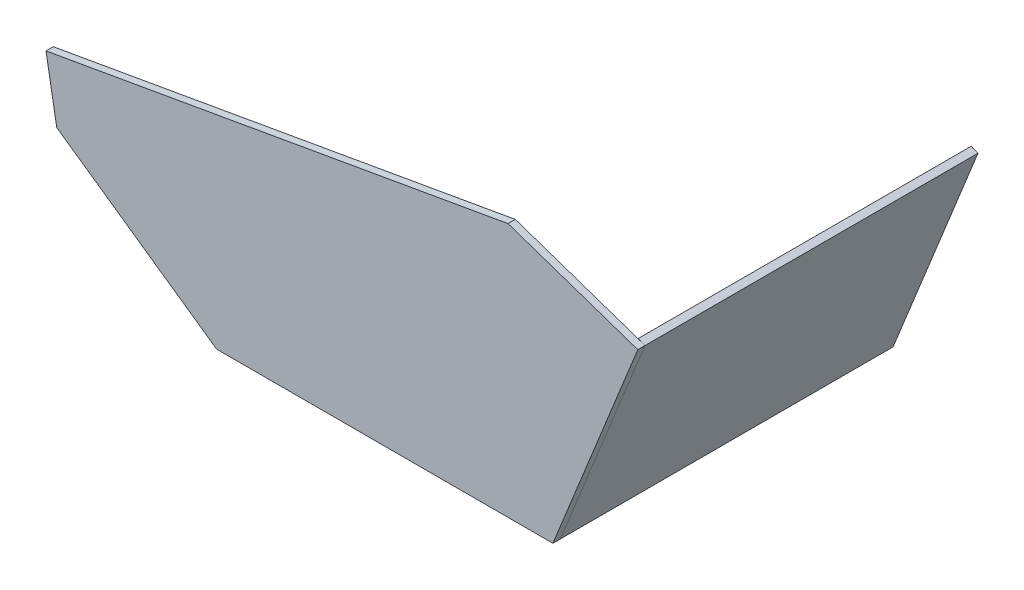
ISO-10303-21;
HEADER;
FILE_DESCRIPTION(('STEP AP214'),'2;1');
FILE_NAME('part.step','',(''),(''),'','','');
FILE_SCHEMA(('AUTOMOTIVE_DESIGN { 1 0 10303 214 1 1 1 1 }'));
ENDSEC;
DATA;
#1=APPLICATION_CONTEXT('core data for automotive mechanical design processes');
#2=APPLICATION_PROTOCOL_DEFINITION('international standard','automotive_design',2000,#1);
#3=PRODUCT_CONTEXT('',#1,'mechanical');
#4=PRODUCT('Part','Part','',(#3));
#5=PRODUCT_RELATED_PRODUCT_CATEGORY('part','',(#4));
#6=PRODUCT_DEFINITION_FORMATION('','',#4);
#7=PRODUCT_DEFINITION_CONTEXT('part definition',#1,'design');
#8=PRODUCT_DEFINITION('design','',#6,#7);
#9=PRODUCT_DEFINITION_SHAPE('','',#8);
#10=(LENGTH_UNIT() NAMED_UNIT(*) SI_UNIT(.MILLI.,.METRE.));
#11=(NAMED_UNIT(*) PLANE_ANGLE_UNIT() SI_UNIT($,.RADIAN.));
#12=(NAMED_UNIT(*) SI_UNIT($,.STERADIAN.) SOLID_ANGLE_UNIT());
#13=UNCERTAINTY_MEASURE_WITH_UNIT(LENGTH_MEASURE(1.E-05),#10,'distance_accuracy_value','');
#14=(GEOMETRIC_REPRESENTATION_CONTEXT(3) GLOBAL_UNCERTAINTY_ASSIGNED_CONTEXT((#13)) GLOBAL_UNIT_ASSIGNED_CONTEXT((#10,
#11,#12)) REPRESENTATION_CONTEXT('',''));
#15=CARTESIAN_POINT('',(0.,0.,0.));
#16=DIRECTION('',(0.,0.,1.));
#17=DIRECTION('',(1.,0.,0.));
#18=AXIS2_PLACEMENT_3D('',#15,#16,#17);
#19=CARTESIAN_POINT('',(218.308936159681,183.058019045167,296.35));
#20=DIRECTION('',(-0.323059329466778,-0.946378713647172,0.));
#21=DIRECTION('',(0.946378713647172,-0.323059329466778,0.));
#22=AXIS2_PLACEMENT_3D('',#19,#20,#21);
#23=PLANE('',#22);
#24=DIRECTION('',(-0.946378713647172,0.323059329466778,0.));
#25=VECTOR('',#24,1.);
#26=CARTESIAN_POINT('',(218.308936159681,183.058019045167,290.));
#27=LINE('',#26,#25);
#28=CARTESIAN_POINT('',(218.308936159681,183.058019045167,290.));
#29=VERTEX_POINT('',#28);
#30=CARTESIAN_POINT('',(105.266414319831,221.64663138417,290.));
#31=VERTEX_POINT('',#30);
#32=EDGE_CURVE('E137',#29,#31,#27,.T.);
#33=ORIENTED_EDGE('',*,*,#32,.T.);
#34=DIRECTION('',(0.,0.,-1.));
#35=VECTOR('',#34,1.);
#36=CARTESIAN_POINT('',(105.266414319831,221.64663138417,296.35));
#37=LINE('',#36,#35);
#38=CARTESIAN_POINT('',(105.266414319831,221.64663138417,296.35));
#39=VERTEX_POINT('',#38);
#40=EDGE_CURVE('E12',#39,#31,#37,.T.);
#41=ORIENTED_EDGE('',*,*,#40,.F.);
#42=DIRECTION('',(-0.946378713647172,0.323059329466778,0.));
#43=VECTOR('',#42,1.);
#44=CARTESIAN_POINT('',(218.308936159681,183.058019045167,296.35));
#45=LINE('',#44,#43);
#46=CARTESIAN_POINT('',(218.308936159681,183.058019045167,296.35));
#47=VERTEX_POINT('',#46);
#48=EDGE_CURVE('E147',#47,#39,#45,.T.);
#49=ORIENTED_EDGE('',*,*,#48,.F.);
#50=DIRECTION('',(0.,0.,-1.));
#51=VECTOR('',#50,1.);
#52=CARTESIAN_POINT('',(218.308936159681,183.058019045167,296.35));
#53=LINE('',#52,#51);
#54=EDGE_CURVE('E133',#47,#29,#53,.T.);
#55=ORIENTED_EDGE('',*,*,#54,.T.);
#56=EDGE_LOOP('',(#33,#41,#49,#55));
#57=FACE_BOUND('',#56,.T.);
#58=ADVANCED_FACE('F53',(#57),#23,.F.);
#59=CARTESIAN_POINT('',(-297.202483124154,150.68050586881,296.35));
#60=DIRECTION('',(0.173648177666924,-0.984807753012209,0.));
#61=DIRECTION('',(0.984807753012209,0.173648177666924,0.));
#62=AXIS2_PLACEMENT_3D('',#59,#60,#61);
#63=PLANE('',#62);
#64=DIRECTION('',(-0.984807753012209,-0.173648177666924,0.));
#65=VECTOR('',#64,1.);
#66=CARTESIAN_POINT('',(-297.202483124154,150.68050586881,290.));
#67=LINE('',#66,#65);
#68=CARTESIAN_POINT('',(-297.202483124154,150.68050586881,290.));
#69=VERTEX_POINT('',#68);
#70=EDGE_CURVE('E140',#31,#69,#67,.T.);
#71=ORIENTED_EDGE('',*,*,#70,.T.);
#72=DIRECTION('',(0.,0.,-1.));
#73=VECTOR('',#72,1.);
#74=CARTESIAN_POINT('',(-297.202483124154,150.68050586881,296.35));
#75=LINE('',#74,#73);
#76=CARTESIAN_POINT('',(-297.202483124154,150.68050586881,296.35));
#77=VERTEX_POINT('',#76);
#78=EDGE_CURVE('E61',#77,#69,#75,.T.);
#79=ORIENTED_EDGE('',*,*,#78,.F.);
#80=DIRECTION('',(-0.984807753012209,-0.173648177666924,0.));
#81=VECTOR('',#80,1.);
#82=CARTESIAN_POINT('',(-297.202483124154,150.68050586881,296.35));
#83=LINE('',#82,#81);
#84=EDGE_CURVE('E106',#39,#77,#83,.T.);
#85=ORIENTED_EDGE('',*,*,#84,.F.);
#86=ORIENTED_EDGE('',*,*,#40,.T.);
#87=EDGE_LOOP('',(#71,#79,#85,#86));
#88=FACE_BOUND('',#87,.T.);
#89=ADVANCED_FACE('F171',(#88),#63,.F.);
#90=CARTESIAN_POINT('',(-287.826734681323,97.5079941796767,296.35));
#91=DIRECTION('',(0.984807753012209,0.173648177666924,0.));
#92=DIRECTION('',(-0.173648177666924,0.984807753012209,0.));
#93=AXIS2_PLACEMENT_3D('',#90,#91,#92);
#94=PLANE('',#93);
#95=DIRECTION('',(0.173648177666924,-0.984807753012209,0.));
#96=VECTOR('',#95,1.);
#97=CARTESIAN_POINT('',(-287.826734681323,97.5079941796767,290.));
#98=LINE('',#97,#96);
#99=CARTESIAN_POINT('',(-287.826734681323,97.5079941796767,290.));
#100=VERTEX_POINT('',#99);
#101=EDGE_CURVE('E142',#69,#100,#98,.T.);
#102=ORIENTED_EDGE('',*,*,#101,.T.);
#103=DIRECTION('',(0.,0.,-1.));
#104=VECTOR('',#103,1.);
#105=CARTESIAN_POINT('',(-287.826734681323,97.5079941796767,296.35));
#106=LINE('',#105,#104);
#107=CARTESIAN_POINT('',(-287.826734681323,97.5079941796767,296.35));
#108=VERTEX_POINT('',#107);
#109=EDGE_CURVE('E128',#108,#100,#106,.T.);
#110=ORIENTED_EDGE('',*,*,#109,.F.);
#111=DIRECTION('',(0.173648177666924,-0.984807753012209,0.));
#112=VECTOR('',#111,1.);
#113=CARTESIAN_POINT('',(-287.826734681323,97.5079941796767,296.35));
#114=LINE('',#113,#112);
#115=EDGE_CURVE('E119',#77,#108,#114,.T.);
#116=ORIENTED_EDGE('',*,*,#115,.F.);
#117=ORIENTED_EDGE('',*,*,#78,.T.);
#118=EDGE_LOOP('',(#102,#110,#116,#117));
#119=FACE_BOUND('',#118,.T.);
#120=ADVANCED_FACE('F153',(#119),#94,.F.);
#121=CARTESIAN_POINT('',(-287.826734681323,97.5079941796767,296.35));
#122=DIRECTION('',(0.57357643635104,0.819152044288996,0.));
#123=DIRECTION('',(-0.819152044288996,0.57357643635104,0.));
#124=AXIS2_PLACEMENT_3D('',#121,#122,#123);
#125=PLANE('',#124);
#126=DIRECTION('',(0.819152044288996,-0.57357643635104,0.));
#127=VECTOR('',#126,1.);
#128=CARTESIAN_POINT('',(-287.826734681323,97.5079941796767,290.));
#129=LINE('',#128,#127);
#130=CARTESIAN_POINT('',(-148.570887152194,0.,290.));
#131=VERTEX_POINT('',#130);
#132=EDGE_CURVE('E127',#100,#131,#129,.T.);
#133=ORIENTED_EDGE('',*,*,#132,.T.);
#134=DIRECTION('',(0.,0.,-1.));
#135=VECTOR('',#134,1.);
#136=CARTESIAN_POINT('',(-148.570887152194,0.,296.35));
#137=LINE('',#136,#135);
#138=CARTESIAN_POINT('',(-148.570887152194,0.,296.35));
#139=VERTEX_POINT('',#138);
#140=EDGE_CURVE('E124',#139,#131,#137,.T.);
#141=ORIENTED_EDGE('',*,*,#140,.F.);
#142=DIRECTION('',(0.819152044288996,-0.57357643635104,0.));
#143=VECTOR('',#142,1.);
#144=CARTESIAN_POINT('',(-287.826734681323,97.5079941796767,296.35));
#145=LINE('',#144,#143);
#146=EDGE_CURVE('E113',#108,#139,#145,.T.);
#147=ORIENTED_EDGE('',*,*,#146,.F.);
#148=ORIENTED_EDGE('',*,*,#109,.T.);
#149=EDGE_LOOP('',(#133,#141,#147,#148));
#150=FACE_BOUND('',#149,.T.);
#151=ADVANCED_FACE('F125',(#150),#125,.F.);
#152=CARTESIAN_POINT('',(144.348695616003,0.,296.35));
#153=DIRECTION('',(0.,1.,0.));
#154=DIRECTION('',(-1.,0.,0.));
#155=AXIS2_PLACEMENT_3D('',#152,#153,#154);
#156=PLANE('',#155);
#157=DIRECTION('',(1.,0.,0.));
#158=VECTOR('',#157,1.);
#159=CARTESIAN_POINT('',(144.348695616003,0.,290.));
#160=LINE('',#159,#158);
#161=CARTESIAN_POINT('',(144.348695616003,0.,290.));
#162=VERTEX_POINT('',#161);
#163=EDGE_CURVE('E92',#131,#162,#160,.T.);
#164=ORIENTED_EDGE('',*,*,#163,.T.);
#165=DIRECTION('',(0.,0.,-1.));
#166=VECTOR('',#165,1.);
#167=CARTESIAN_POINT('',(144.348695616003,0.,296.35));
#168=LINE('',#167,#166);
#169=CARTESIAN_POINT('',(144.348695616003,0.,296.35));
#170=VERTEX_POINT('',#169);
#171=EDGE_CURVE('E129',#170,#162,#168,.T.);
#172=ORIENTED_EDGE('',*,*,#171,.F.);
#173=DIRECTION('',(1.,0.,0.));
#174=VECTOR('',#173,1.);
#175=CARTESIAN_POINT('',(144.348695616003,0.,296.35));
#176=LINE('',#175,#174);
#177=EDGE_CURVE('E117',#139,#170,#176,.T.);
#178=ORIENTED_EDGE('',*,*,#177,.F.);
#179=ORIENTED_EDGE('',*,*,#140,.T.);
#180=EDGE_LOOP('',(#164,#172,#178,#179));
#181=FACE_BOUND('',#180,.T.);
#182=ADVANCED_FACE('F131',(#181),#156,.F.);
#183=CARTESIAN_POINT('',(144.348695616003,0.,296.35));
#184=DIRECTION('',(-0.927183854566789,0.374606593415909,0.));
#185=DIRECTION('',(-0.374606593415909,-0.927183854566789,0.));
#186=AXIS2_PLACEMENT_3D('',#183,#184,#185);
#187=PLANE('',#186);
#188=DIRECTION('',(0.374606593415909,0.927183854566789,0.));
#189=VECTOR('',#188,1.);
#190=CARTESIAN_POINT('',(144.348695616003,0.,290.));
#191=LINE('',#190,#189);
#192=EDGE_CURVE('E98',#162,#29,#191,.T.);
#193=ORIENTED_EDGE('',*,*,#192,.T.);
#194=ORIENTED_EDGE('',*,*,#54,.F.);
#195=DIRECTION('',(0.374606593415909,0.927183854566789,0.));
#196=VECTOR('',#195,1.);
#197=CARTESIAN_POINT('',(144.348695616003,0.,296.35));
#198=LINE('',#197,#196);
#199=EDGE_CURVE('E69',#170,#47,#198,.T.);
#200=ORIENTED_EDGE('',*,*,#199,.F.);
#201=ORIENTED_EDGE('',*,*,#171,.T.);
#202=EDGE_LOOP('',(#193,#194,#200,#201));
#203=FACE_BOUND('',#202,.T.);
#204=ADVANCED_FACE('F160',(#203),#187,.F.);
#205=CARTESIAN_POINT('',(0.,0.,296.35));
#206=DIRECTION('',(0.,0.,-1.));
#207=DIRECTION('',(-1.,0.,0.));
#208=AXIS2_PLACEMENT_3D('',#205,#206,#207);
#209=PLANE('',#208);
#210=ORIENTED_EDGE('',*,*,#48,.T.);
#211=ORIENTED_EDGE('',*,*,#84,.T.);
#212=ORIENTED_EDGE('',*,*,#115,.T.);
#213=ORIENTED_EDGE('',*,*,#146,.T.);
#214=ORIENTED_EDGE('',*,*,#177,.T.);
#215=ORIENTED_EDGE('',*,*,#199,.T.);
#216=EDGE_LOOP('',(#210,#211,#212,#213,#214,#215));
#217=FACE_BOUND('',#216,.T.);
#218=ADVANCED_FACE('F115',(#217),#209,.F.);
#219=CARTESIAN_POINT('',(0.,0.,290.));
#220=DIRECTION('',(0.,0.,-1.));
#221=DIRECTION('',(-1.,0.,0.));
#222=AXIS2_PLACEMENT_3D('',#219,#220,#221);
#223=PLANE('',#222);
#224=ORIENTED_EDGE('',*,*,#32,.F.);
#225=ORIENTED_EDGE('',*,*,#192,.F.);
#226=ORIENTED_EDGE('',*,*,#163,.F.);
#227=ORIENTED_EDGE('',*,*,#132,.F.);
#228=ORIENTED_EDGE('',*,*,#101,.F.);
#229=ORIENTED_EDGE('',*,*,#70,.F.);
#230=EDGE_LOOP('',(#224,#225,#226,#227,#228,#229));
#231=FACE_BOUND('',#230,.T.);
#232=ADVANCED_FACE('F156',(#231),#223,.T.);
#233=CLOSED_SHELL('',(#58,#89,#120,#151,#182,#204,#218,#232));
#234=MANIFOLD_SOLID_BREP('B2',#233);
#235=CARTESIAN_POINT('',(212.421318683182,185.436770913358,290.));
#236=DIRECTION('',(0.927183854566788,-0.374606593415909,0.));
#237=DIRECTION('',(0.374606593415909,0.927183854566789,0.));
#238=AXIS2_PLACEMENT_3D('',#235,#236,#237);
#239=PLANE('',#238);
#240=DIRECTION('',(-0.374606593415909,-0.927183854566789,0.));
#241=VECTOR('',#240,1.);
#242=CARTESIAN_POINT('',(212.421318683182,185.436770913358,0.));
#243=LINE('',#242,#241);
#244=CARTESIAN_POINT('',(212.421318683182,185.436770913358,0.));
#245=VERTEX_POINT('',#244);
#246=CARTESIAN_POINT('',(137.5,0.,0.));
#247=VERTEX_POINT('',#246);
#248=EDGE_CURVE('E292',#245,#247,#243,.T.);
#249=ORIENTED_EDGE('',*,*,#248,.T.);
#250=DIRECTION('',(0.,0.,-1.));
#251=VECTOR('',#250,1.);
#252=CARTESIAN_POINT('',(137.5,0.,290.));
#253=LINE('',#252,#251);
#254=CARTESIAN_POINT('',(137.5,0.,290.));
#255=VERTEX_POINT('',#254);
#256=EDGE_CURVE('E51',#255,#247,#253,.T.);
#257=ORIENTED_EDGE('',*,*,#256,.F.);
#258=DIRECTION('',(-0.374606593415909,-0.927183854566789,0.));
#259=VECTOR('',#258,1.);
#260=CARTESIAN_POINT('',(212.421318683182,185.436770913358,290.));
#261=LINE('',#260,#259);
#262=CARTESIAN_POINT('',(212.421318683182,185.436770913358,290.));
#263=VERTEX_POINT('',#262);
#264=EDGE_CURVE('E280',#263,#255,#261,.T.);
#265=ORIENTED_EDGE('',*,*,#264,.F.);
#266=DIRECTION('',(0.,0.,-1.));
#267=VECTOR('',#266,1.);
#268=CARTESIAN_POINT('',(212.421318683182,185.436770913358,290.));
#269=LINE('',#268,#267);
#270=EDGE_CURVE('E288',#263,#245,#269,.T.);
#271=ORIENTED_EDGE('',*,*,#270,.T.);
#272=EDGE_LOOP('',(#249,#257,#265,#271));
#273=FACE_BOUND('',#272,.T.);
#274=ADVANCED_FACE('F229',(#273),#239,.F.);
#275=CARTESIAN_POINT('',(137.5,0.,290.));
#276=DIRECTION('',(0.,1.,0.));
#277=DIRECTION('',(-1.,0.,0.));
#278=AXIS2_PLACEMENT_3D('',#275,#276,#277);
#279=PLANE('',#278);
#280=DIRECTION('',(1.,0.,0.));
#281=VECTOR('',#280,1.);
#282=CARTESIAN_POINT('',(137.5,0.,0.));
#283=LINE('',#282,#281);
#284=CARTESIAN_POINT('',(144.348695616003,0.,0.));
#285=VERTEX_POINT('',#284);
#286=EDGE_CURVE('E284',#247,#285,#283,.T.);
#287=ORIENTED_EDGE('',*,*,#286,.T.);
#288=DIRECTION('',(0.,0.,-1.));
#289=VECTOR('',#288,1.);
#290=CARTESIAN_POINT('',(144.348695616003,0.,290.));
#291=LINE('',#290,#289);
#292=CARTESIAN_POINT('',(144.348695616003,0.,290.));
#293=VERTEX_POINT('',#292);
#294=EDGE_CURVE('E237',#293,#285,#291,.T.);
#295=ORIENTED_EDGE('',*,*,#294,.F.);
#296=DIRECTION('',(1.,0.,0.));
#297=VECTOR('',#296,1.);
#298=CARTESIAN_POINT('',(137.5,0.,290.));
#299=LINE('',#298,#297);
#300=EDGE_CURVE('E275',#255,#293,#299,.T.);
#301=ORIENTED_EDGE('',*,*,#300,.F.);
#302=ORIENTED_EDGE('',*,*,#256,.T.);
#303=EDGE_LOOP('',(#287,#295,#301,#302));
#304=FACE_BOUND('',#303,.T.);
#305=ADVANCED_FACE('F283',(#304),#279,.F.);
#306=CARTESIAN_POINT('',(144.348695616003,0.,290.));
#307=DIRECTION('',(-0.927183854566789,0.374606593415909,0.));
#308=DIRECTION('',(-0.374606593415909,-0.927183854566789,0.));
#309=AXIS2_PLACEMENT_3D('',#306,#307,#308);
#310=PLANE('',#309);
#311=DIRECTION('',(0.374606593415909,0.927183854566789,0.));
#312=VECTOR('',#311,1.);
#313=CARTESIAN_POINT('',(144.348695616003,0.,0.));
#314=LINE('',#313,#312);
#315=CARTESIAN_POINT('',(218.308936159681,183.058019045167,0.));
#316=VERTEX_POINT('',#315);
#317=EDGE_CURVE('E262',#285,#316,#314,.T.);
#318=ORIENTED_EDGE('',*,*,#317,.T.);
#319=DIRECTION('',(0.,0.,-1.));
#320=VECTOR('',#319,1.);
#321=CARTESIAN_POINT('',(218.308936159681,183.058019045167,290.));
#322=LINE('',#321,#320);
#323=CARTESIAN_POINT('',(218.308936159681,183.058019045167,290.));
#324=VERTEX_POINT('',#323);
#325=EDGE_CURVE('E285',#324,#316,#322,.T.);
#326=ORIENTED_EDGE('',*,*,#325,.F.);
#327=DIRECTION('',(0.374606593415909,0.927183854566789,0.));
#328=VECTOR('',#327,1.);
#329=CARTESIAN_POINT('',(144.348695616003,0.,290.));
#330=LINE('',#329,#328);
#331=EDGE_CURVE('E278',#293,#324,#330,.T.);
#332=ORIENTED_EDGE('',*,*,#331,.F.);
#333=ORIENTED_EDGE('',*,*,#294,.T.);
#334=EDGE_LOOP('',(#318,#326,#332,#333));
#335=FACE_BOUND('',#334,.T.);
#336=ADVANCED_FACE('F286',(#335),#310,.F.);
#337=CARTESIAN_POINT('',(218.308936159681,183.058019045167,290.));
#338=DIRECTION('',(-0.374606593415908,-0.927183854566789,0.));
#339=DIRECTION('',(0.927183854566789,-0.374606593415908,0.));
#340=AXIS2_PLACEMENT_3D('',#337,#338,#339);
#341=PLANE('',#340);
#342=DIRECTION('',(-0.927183854566789,0.374606593415908,0.));
#343=VECTOR('',#342,1.);
#344=CARTESIAN_POINT('',(218.308936159681,183.058019045167,0.));
#345=LINE('',#344,#343);
#346=EDGE_CURVE('E268',#316,#245,#345,.T.);
#347=ORIENTED_EDGE('',*,*,#346,.T.);
#348=ORIENTED_EDGE('',*,*,#270,.F.);
#349=DIRECTION('',(-0.927183854566789,0.374606593415908,0.));
#350=VECTOR('',#349,1.);
#351=CARTESIAN_POINT('',(218.308936159681,183.058019045167,290.));
#352=LINE('',#351,#350);
#353=EDGE_CURVE('E245',#324,#263,#352,.T.);
#354=ORIENTED_EDGE('',*,*,#353,.F.);
#355=ORIENTED_EDGE('',*,*,#325,.T.);
#356=EDGE_LOOP('',(#347,#348,#354,#355));
#357=FACE_BOUND('',#356,.T.);
#358=ADVANCED_FACE('F299',(#357),#341,.F.);
#359=CARTESIAN_POINT('',(0.,0.,290.));
#360=DIRECTION('',(0.,0.,-1.));
#361=DIRECTION('',(-1.,0.,0.));
#362=AXIS2_PLACEMENT_3D('',#359,#360,#361);
#363=PLANE('',#362);
#364=ORIENTED_EDGE('',*,*,#264,.T.);
#365=ORIENTED_EDGE('',*,*,#300,.T.);
#366=ORIENTED_EDGE('',*,*,#331,.T.);
#367=ORIENTED_EDGE('',*,*,#353,.T.);
#368=EDGE_LOOP('',(#364,#365,#366,#367));
#369=FACE_BOUND('',#368,.T.);
#370=ADVANCED_FACE('F276',(#369),#363,.F.);
#371=CARTESIAN_POINT('',(0.,0.,0.));
#372=DIRECTION('',(0.,0.,-1.));
#373=DIRECTION('',(-1.,0.,0.));
#374=AXIS2_PLACEMENT_3D('',#371,#372,#373);
#375=PLANE('',#374);
#376=ORIENTED_EDGE('',*,*,#248,.F.);
#377=ORIENTED_EDGE('',*,*,#346,.F.);
#378=ORIENTED_EDGE('',*,*,#317,.F.);
#379=ORIENTED_EDGE('',*,*,#286,.F.);
#380=EDGE_LOOP('',(#376,#377,#378,#379));
#381=FACE_BOUND('',#380,.T.);
#382=ADVANCED_FACE('F302',(#381),#375,.T.);
#383=CLOSED_SHELL('',(#274,#305,#336,#358,#370,#382));
#384=MANIFOLD_SOLID_BREP('B6',#383);
#385=ADVANCED_BREP_SHAPE_REPRESENTATION('',(#18,#234,#384),#14);
#386=SHAPE_DEFINITION_REPRESENTATION(#9,#385);
ENDSEC;
END-ISO-10303-21;
